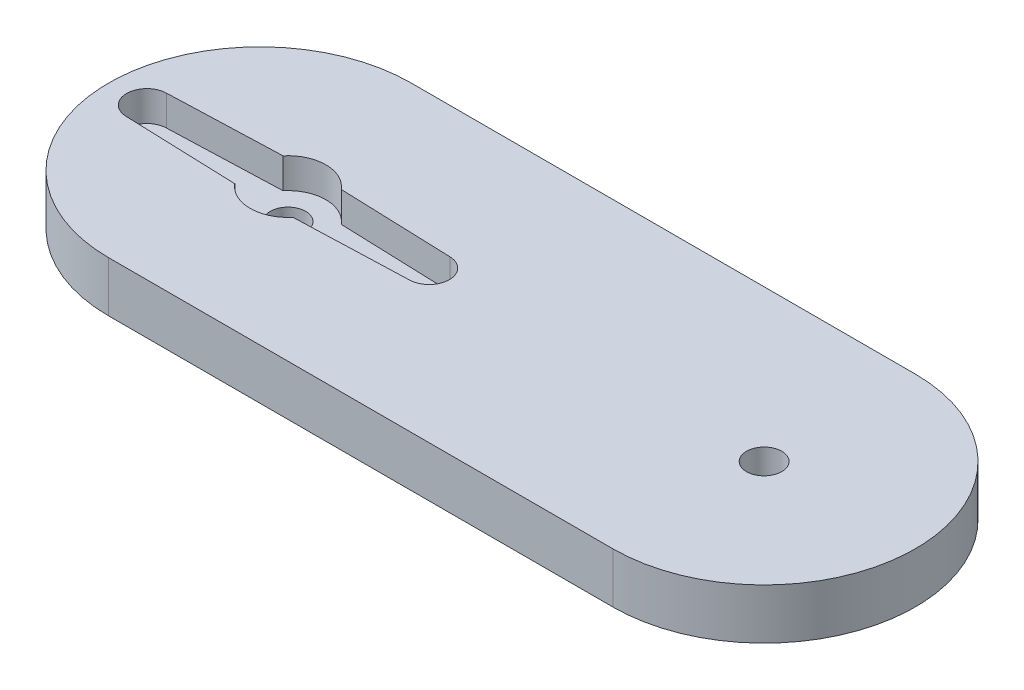
ISO-10303-21;
HEADER;
FILE_DESCRIPTION(('STEP AP214'),'2;1');
FILE_NAME('part.step','',(''),(''),'','','');
FILE_SCHEMA(('AUTOMOTIVE_DESIGN { 1 0 10303 214 1 1 1 1 }'));
ENDSEC;
DATA;
#1=APPLICATION_CONTEXT('core data for automotive mechanical design processes');
#2=APPLICATION_PROTOCOL_DEFINITION('international standard','automotive_design',2000,#1);
#3=PRODUCT_CONTEXT('',#1,'mechanical');
#4=PRODUCT('Part','Part','',(#3));
#5=PRODUCT_RELATED_PRODUCT_CATEGORY('part','',(#4));
#6=PRODUCT_DEFINITION_FORMATION('','',#4);
#7=PRODUCT_DEFINITION_CONTEXT('part definition',#1,'design');
#8=PRODUCT_DEFINITION('design','',#6,#7);
#9=PRODUCT_DEFINITION_SHAPE('','',#8);
#10=(LENGTH_UNIT() NAMED_UNIT(*) SI_UNIT(.MILLI.,.METRE.));
#11=(NAMED_UNIT(*) PLANE_ANGLE_UNIT() SI_UNIT($,.RADIAN.));
#12=(NAMED_UNIT(*) SI_UNIT($,.STERADIAN.) SOLID_ANGLE_UNIT());
#13=UNCERTAINTY_MEASURE_WITH_UNIT(LENGTH_MEASURE(1.E-05),#10,'distance_accuracy_value','');
#14=(GEOMETRIC_REPRESENTATION_CONTEXT(3) GLOBAL_UNCERTAINTY_ASSIGNED_CONTEXT((#13)) GLOBAL_UNIT_ASSIGNED_CONTEXT((#10,
#11,#12)) REPRESENTATION_CONTEXT('',''));
#15=CARTESIAN_POINT('',(0.,0.,0.));
#16=DIRECTION('',(0.,0.,1.));
#17=DIRECTION('',(1.,0.,0.));
#18=AXIS2_PLACEMENT_3D('',#15,#16,#17);
#19=CARTESIAN_POINT('',(0.,5.,0.));
#20=DIRECTION('',(0.,-1.,0.));
#21=DIRECTION('',(0.,0.,-1.));
#22=AXIS2_PLACEMENT_3D('',#19,#20,#21);
#23=PLANE('',#22);
#24=CARTESIAN_POINT('',(0.,5.,0.));
#25=DIRECTION('',(0.,1.,0.));
#26=DIRECTION('',(0.,0.,-1.));
#27=AXIS2_PLACEMENT_3D('',#24,#25,#26);
#28=CIRCLE('',#27,15.);
#29=CARTESIAN_POINT('',(0.,5.,15.));
#30=VERTEX_POINT('',#29);
#31=CARTESIAN_POINT('',(0.,5.,-15.));
#32=VERTEX_POINT('',#31);
#33=EDGE_CURVE('E213',#30,#32,#28,.T.);
#34=ORIENTED_EDGE('',*,*,#33,.T.);
#35=DIRECTION('',(-1.,0.,0.));
#36=VECTOR('',#35,1.);
#37=CARTESIAN_POINT('',(-50.,5.,-15.));
#38=LINE('',#37,#36);
#39=CARTESIAN_POINT('',(-50.,5.,-15.));
#40=VERTEX_POINT('',#39);
#41=EDGE_CURVE('E93',#32,#40,#38,.T.);
#42=ORIENTED_EDGE('',*,*,#41,.T.);
#43=CARTESIAN_POINT('',(-50.,5.,0.));
#44=DIRECTION('',(0.,1.,0.));
#45=DIRECTION('',(0.,0.,1.));
#46=AXIS2_PLACEMENT_3D('',#43,#44,#45);
#47=CIRCLE('',#46,15.);
#48=CARTESIAN_POINT('',(-50.,5.,15.));
#49=VERTEX_POINT('',#48);
#50=EDGE_CURVE('E216',#40,#49,#47,.T.);
#51=ORIENTED_EDGE('',*,*,#50,.T.);
#52=DIRECTION('',(1.,0.,0.));
#53=VECTOR('',#52,1.);
#54=CARTESIAN_POINT('',(-50.,5.,15.));
#55=LINE('',#54,#53);
#56=EDGE_CURVE('E65',#49,#30,#55,.T.);
#57=ORIENTED_EDGE('',*,*,#56,.T.);
#58=EDGE_LOOP('',(#34,#42,#51,#57));
#59=FACE_BOUND('',#58,.T.);
#60=CARTESIAN_POINT('',(0.,5.,0.));
#61=DIRECTION('',(0.,1.,0.));
#62=DIRECTION('',(0.,0.,-1.));
#63=AXIS2_PLACEMENT_3D('',#60,#61,#62);
#64=CIRCLE('',#63,1.75);
#65=CARTESIAN_POINT('',(0.,5.,-1.75000000000001));
#66=VERTEX_POINT('',#65);
#67=EDGE_CURVE('E199',#66,#66,#64,.T.);
#68=ORIENTED_EDGE('',*,*,#67,.F.);
#69=EDGE_LOOP('',(#68));
#70=FACE_BOUND('',#69,.T.);
#71=CARTESIAN_POINT('',(-61.2106377870323,5.,0.));
#72=DIRECTION('',(0.,1.,0.));
#73=DIRECTION('',(0.,0.,1.));
#74=AXIS2_PLACEMENT_3D('',#71,#72,#73);
#75=CIRCLE('',#74,1.99999999999989);
#76=CARTESIAN_POINT('',(-61.2814656274018,5.,1.99874546078984));
#77=VERTEX_POINT('',#76);
#78=CARTESIAN_POINT('',(-61.2814656274019,5.,-1.99874546078982));
#79=VERTEX_POINT('',#78);
#80=EDGE_CURVE('E56',#77,#79,#75,.F.);
#81=ORIENTED_EDGE('',*,*,#80,.T.);
#82=DIRECTION('',(0.999372730394993,0.,-0.0354139201848141));
#83=VECTOR('',#82,1.);
#84=CARTESIAN_POINT('',(-0.147594901167753,5.,-4.16509436409831));
#85=LINE('',#84,#83);
#86=CARTESIAN_POINT('',(-50.0961084973095,5.,-2.39511143376086));
#87=VERTEX_POINT('',#86);
#88=EDGE_CURVE('E156',#79,#87,#85,.T.);
#89=ORIENTED_EDGE('',*,*,#88,.T.);
#90=CARTESIAN_POINT('',(-47.2106377870323,5.,0.));
#91=DIRECTION('',(0.,1.,0.));
#92=DIRECTION('',(0.,0.,1.));
#93=AXIS2_PLACEMENT_3D('',#90,#91,#92);
#94=CIRCLE('',#93,3.74999999999991);
#95=CARTESIAN_POINT('',(-44.3251670767553,5.,-2.39511143376105));
#96=VERTEX_POINT('',#95);
#97=EDGE_CURVE('E192',#96,#87,#94,.T.);
#98=ORIENTED_EDGE('',*,*,#97,.F.);
#99=DIRECTION('',(-0.999372730394995,0.,-0.0354139201847496));
#100=VECTOR('',#99,1.);
#101=CARTESIAN_POINT('',(0.0291768603715252,5.,-0.823364328538849));
#102=LINE('',#101,#100);
#103=CARTESIAN_POINT('',(-33.1398099466627,5.,-1.99874546079073));
#104=VERTEX_POINT('',#103);
#105=EDGE_CURVE('E189',#104,#96,#102,.T.);
#106=ORIENTED_EDGE('',*,*,#105,.F.);
#107=CARTESIAN_POINT('',(-33.2106377870322,5.,-2.6382402541072E-12));
#108=DIRECTION('',(0.,1.,0.));
#109=DIRECTION('',(0.,0.,1.));
#110=AXIS2_PLACEMENT_3D('',#107,#108,#109);
#111=CIRCLE('',#110,1.9999999999981);
#112=CARTESIAN_POINT('',(-33.1398099466627,5.,1.99874546078946));
#113=VERTEX_POINT('',#112);
#114=EDGE_CURVE('E186',#113,#104,#111,.T.);
#115=ORIENTED_EDGE('',*,*,#114,.F.);
#116=DIRECTION('',(-0.999372730394992,0.,0.035413920184841));
#117=VECTOR('',#116,1.);
#118=CARTESIAN_POINT('',(0.0291768603714483,5.,0.823364328534549));
#119=LINE('',#118,#117);
#120=CARTESIAN_POINT('',(-44.3251670767551,5.,2.39511143376081));
#121=VERTEX_POINT('',#120);
#122=EDGE_CURVE('E183',#113,#121,#119,.T.);
#123=ORIENTED_EDGE('',*,*,#122,.T.);
#124=CARTESIAN_POINT('',(-47.2106377870323,5.,0.));
#125=DIRECTION('',(0.,1.,0.));
#126=DIRECTION('',(0.,0.,1.));
#127=AXIS2_PLACEMENT_3D('',#124,#125,#126);
#128=CIRCLE('',#127,3.74999999999992);
#129=CARTESIAN_POINT('',(-50.0961084973095,5.,2.39511143376087));
#130=VERTEX_POINT('',#129);
#131=EDGE_CURVE('E180',#130,#121,#128,.T.);
#132=ORIENTED_EDGE('',*,*,#131,.F.);
#133=DIRECTION('',(0.999372730394993,0.,0.0354139201848138));
#134=VECTOR('',#133,1.);
#135=CARTESIAN_POINT('',(-0.147594901167751,5.,4.1650943640983));
#136=LINE('',#135,#134);
#137=EDGE_CURVE('E177',#77,#130,#136,.T.);
#138=ORIENTED_EDGE('',*,*,#137,.F.);
#139=EDGE_LOOP('',(#81,#89,#98,#106,#115,#123,#132,#138));
#140=FACE_BOUND('',#139,.T.);
#141=ADVANCED_FACE('F40',(#59,#70,#140),#23,.F.);
#142=CARTESIAN_POINT('',(0.,5.,0.));
#143=DIRECTION('',(0.,-1.,0.));
#144=DIRECTION('',(0.,0.,-1.));
#145=AXIS2_PLACEMENT_3D('',#142,#143,#144);
#146=CYLINDRICAL_SURFACE('',#145,15.);
#147=CARTESIAN_POINT('',(0.,0.,0.));
#148=DIRECTION('',(0.,1.,0.));
#149=DIRECTION('',(0.,0.,-1.));
#150=AXIS2_PLACEMENT_3D('',#147,#148,#149);
#151=CIRCLE('',#150,15.);
#152=CARTESIAN_POINT('',(0.,0.,15.));
#153=VERTEX_POINT('',#152);
#154=CARTESIAN_POINT('',(0.,0.,-15.));
#155=VERTEX_POINT('',#154);
#156=EDGE_CURVE('E220',#153,#155,#151,.T.);
#157=ORIENTED_EDGE('',*,*,#156,.T.);
#158=DIRECTION('',(0.,-1.,0.));
#159=VECTOR('',#158,1.);
#160=CARTESIAN_POINT('',(0.,5.,-15.));
#161=LINE('',#160,#159);
#162=EDGE_CURVE('E11',#32,#155,#161,.T.);
#163=ORIENTED_EDGE('',*,*,#162,.F.);
#164=ORIENTED_EDGE('',*,*,#33,.F.);
#165=DIRECTION('',(0.,-1.,0.));
#166=VECTOR('',#165,1.);
#167=CARTESIAN_POINT('',(0.,5.,15.));
#168=LINE('',#167,#166);
#169=EDGE_CURVE('E219',#30,#153,#168,.T.);
#170=ORIENTED_EDGE('',*,*,#169,.T.);
#171=EDGE_LOOP('',(#157,#163,#164,#170));
#172=FACE_BOUND('',#171,.T.);
#173=ADVANCED_FACE('F42',(#172),#146,.T.);
#174=CARTESIAN_POINT('',(-50.,5.,-15.));
#175=DIRECTION('',(0.,0.,1.));
#176=DIRECTION('',(1.,0.,0.));
#177=AXIS2_PLACEMENT_3D('',#174,#175,#176);
#178=PLANE('',#177);
#179=DIRECTION('',(-1.,0.,0.));
#180=VECTOR('',#179,1.);
#181=CARTESIAN_POINT('',(-50.,0.,-15.));
#182=LINE('',#181,#180);
#183=CARTESIAN_POINT('',(-50.,0.,-15.));
#184=VERTEX_POINT('',#183);
#185=EDGE_CURVE('E223',#155,#184,#182,.T.);
#186=ORIENTED_EDGE('',*,*,#185,.T.);
#187=DIRECTION('',(0.,-1.,0.));
#188=VECTOR('',#187,1.);
#189=CARTESIAN_POINT('',(-50.,5.,-15.));
#190=LINE('',#189,#188);
#191=EDGE_CURVE('E49',#40,#184,#190,.T.);
#192=ORIENTED_EDGE('',*,*,#191,.F.);
#193=ORIENTED_EDGE('',*,*,#41,.F.);
#194=ORIENTED_EDGE('',*,*,#162,.T.);
#195=EDGE_LOOP('',(#186,#192,#193,#194));
#196=FACE_BOUND('',#195,.T.);
#197=ADVANCED_FACE('F253',(#196),#178,.F.);
#198=CARTESIAN_POINT('',(-50.,5.,0.));
#199=DIRECTION('',(0.,-1.,0.));
#200=DIRECTION('',(0.,0.,-1.));
#201=AXIS2_PLACEMENT_3D('',#198,#199,#200);
#202=CYLINDRICAL_SURFACE('',#201,15.);
#203=CARTESIAN_POINT('',(-50.,0.,0.));
#204=DIRECTION('',(0.,1.,0.));
#205=DIRECTION('',(0.,0.,1.));
#206=AXIS2_PLACEMENT_3D('',#203,#204,#205);
#207=CIRCLE('',#206,15.);
#208=CARTESIAN_POINT('',(-50.,0.,15.));
#209=VERTEX_POINT('',#208);
#210=EDGE_CURVE('E225',#184,#209,#207,.T.);
#211=ORIENTED_EDGE('',*,*,#210,.T.);
#212=DIRECTION('',(0.,-1.,0.));
#213=VECTOR('',#212,1.);
#214=CARTESIAN_POINT('',(-50.,5.,15.));
#215=LINE('',#214,#213);
#216=EDGE_CURVE('E229',#49,#209,#215,.T.);
#217=ORIENTED_EDGE('',*,*,#216,.F.);
#218=ORIENTED_EDGE('',*,*,#50,.F.);
#219=ORIENTED_EDGE('',*,*,#191,.T.);
#220=EDGE_LOOP('',(#211,#217,#218,#219));
#221=FACE_BOUND('',#220,.T.);
#222=ADVANCED_FACE('F235',(#221),#202,.T.);
#223=CARTESIAN_POINT('',(-50.,5.,15.));
#224=DIRECTION('',(0.,0.,-1.));
#225=DIRECTION('',(-1.,0.,0.));
#226=AXIS2_PLACEMENT_3D('',#223,#224,#225);
#227=PLANE('',#226);
#228=DIRECTION('',(1.,0.,0.));
#229=VECTOR('',#228,1.);
#230=CARTESIAN_POINT('',(-50.,0.,15.));
#231=LINE('',#230,#229);
#232=EDGE_CURVE('E86',#209,#153,#231,.T.);
#233=ORIENTED_EDGE('',*,*,#232,.T.);
#234=ORIENTED_EDGE('',*,*,#169,.F.);
#235=ORIENTED_EDGE('',*,*,#56,.F.);
#236=ORIENTED_EDGE('',*,*,#216,.T.);
#237=EDGE_LOOP('',(#233,#234,#235,#236));
#238=FACE_BOUND('',#237,.T.);
#239=ADVANCED_FACE('F243',(#238),#227,.F.);
#240=CARTESIAN_POINT('',(0.,0.,0.));
#241=DIRECTION('',(0.,-1.,0.));
#242=DIRECTION('',(0.,0.,-1.));
#243=AXIS2_PLACEMENT_3D('',#240,#241,#242);
#244=PLANE('',#243);
#245=CARTESIAN_POINT('',(-47.2106377870323,0.,0.));
#246=DIRECTION('',(0.,-1.,0.));
#247=DIRECTION('',(0.,0.,-1.));
#248=AXIS2_PLACEMENT_3D('',#245,#246,#247);
#249=CIRCLE('',#248,1.75);
#250=CARTESIAN_POINT('',(-47.2106377870323,0.,-1.75000000000001));
#251=VERTEX_POINT('',#250);
#252=EDGE_CURVE('E178',#251,#251,#249,.T.);
#253=ORIENTED_EDGE('',*,*,#252,.F.);
#254=EDGE_LOOP('',(#253));
#255=FACE_BOUND('',#254,.T.);
#256=CARTESIAN_POINT('',(0.,0.,0.));
#257=DIRECTION('',(0.,-1.,0.));
#258=DIRECTION('',(0.,0.,-1.));
#259=AXIS2_PLACEMENT_3D('',#256,#257,#258);
#260=CIRCLE('',#259,1.75);
#261=CARTESIAN_POINT('',(0.,0.,-1.75000000000001));
#262=VERTEX_POINT('',#261);
#263=EDGE_CURVE('E44',#262,#262,#260,.T.);
#264=ORIENTED_EDGE('',*,*,#263,.F.);
#265=EDGE_LOOP('',(#264));
#266=FACE_BOUND('',#265,.T.);
#267=ORIENTED_EDGE('',*,*,#156,.F.);
#268=ORIENTED_EDGE('',*,*,#232,.F.);
#269=ORIENTED_EDGE('',*,*,#210,.F.);
#270=ORIENTED_EDGE('',*,*,#185,.F.);
#271=EDGE_LOOP('',(#267,#268,#269,#270));
#272=FACE_BOUND('',#271,.T.);
#273=ADVANCED_FACE('F239',(#255,#266,#272),#244,.T.);
#274=CARTESIAN_POINT('',(0.,-5.,0.));
#275=DIRECTION('',(0.,1.,0.));
#276=DIRECTION('',(0.,0.,1.));
#277=AXIS2_PLACEMENT_3D('',#274,#275,#276);
#278=CYLINDRICAL_SURFACE('',#277,1.75);
#279=ORIENTED_EDGE('',*,*,#263,.T.);
#280=EDGE_LOOP('',(#279));
#281=FACE_BOUND('',#280,.T.);
#282=ORIENTED_EDGE('',*,*,#67,.T.);
#283=EDGE_LOOP('',(#282));
#284=FACE_BOUND('',#283,.T.);
#285=ADVANCED_FACE('F250',(#281,#284),#278,.F.);
#286=CARTESIAN_POINT('',(-61.2106377870323,2.,0.));
#287=DIRECTION('',(0.,1.,0.));
#288=DIRECTION('',(0.,0.,1.));
#289=AXIS2_PLACEMENT_3D('',#286,#287,#288);
#290=CYLINDRICAL_SURFACE('',#289,1.99999999999989);
#291=ORIENTED_EDGE('',*,*,#80,.F.);
#292=DIRECTION('',(0.,1.,0.));
#293=VECTOR('',#292,1.);
#294=CARTESIAN_POINT('',(-61.2814656274018,2.,1.99874546078984));
#295=LINE('',#294,#293);
#296=CARTESIAN_POINT('',(-61.2814656274018,2.,1.99874546078984));
#297=VERTEX_POINT('',#296);
#298=EDGE_CURVE('E138',#297,#77,#295,.T.);
#299=ORIENTED_EDGE('',*,*,#298,.F.);
#300=CARTESIAN_POINT('',(-61.2106377870323,2.,0.));
#301=DIRECTION('',(0.,1.,0.));
#302=DIRECTION('',(0.,0.,1.));
#303=AXIS2_PLACEMENT_3D('',#300,#301,#302);
#304=CIRCLE('',#303,1.99999999999989);
#305=CARTESIAN_POINT('',(-61.2814656274019,2.,-1.99874546078982));
#306=VERTEX_POINT('',#305);
#307=EDGE_CURVE('E141',#297,#306,#304,.F.);
#308=ORIENTED_EDGE('',*,*,#307,.T.);
#309=DIRECTION('',(0.,1.,0.));
#310=VECTOR('',#309,1.);
#311=CARTESIAN_POINT('',(-61.2814656274019,2.,-1.99874546078982));
#312=LINE('',#311,#310);
#313=EDGE_CURVE('E197',#306,#79,#312,.T.);
#314=ORIENTED_EDGE('',*,*,#313,.T.);
#315=EDGE_LOOP('',(#291,#299,#308,#314));
#316=FACE_BOUND('',#315,.T.);
#317=ADVANCED_FACE('F140',(#316),#290,.F.);
#318=CARTESIAN_POINT('',(-0.147594901167753,2.,-4.16509436409831));
#319=DIRECTION('',(0.0354139201848141,0.,0.999372730394993));
#320=DIRECTION('',(0.999372730394993,0.,-0.0354139201848141));
#321=AXIS2_PLACEMENT_3D('',#318,#319,#320);
#322=PLANE('',#321);
#323=ORIENTED_EDGE('',*,*,#88,.F.);
#324=ORIENTED_EDGE('',*,*,#313,.F.);
#325=DIRECTION('',(0.999372730394993,0.,-0.0354139201848141));
#326=VECTOR('',#325,1.);
#327=CARTESIAN_POINT('',(-0.147594901167753,2.,-4.16509436409831));
#328=LINE('',#327,#326);
#329=CARTESIAN_POINT('',(-50.0961084973095,2.,-2.39511143376086));
#330=VERTEX_POINT('',#329);
#331=EDGE_CURVE('E148',#306,#330,#328,.T.);
#332=ORIENTED_EDGE('',*,*,#331,.T.);
#333=DIRECTION('',(0.,1.,0.));
#334=VECTOR('',#333,1.);
#335=CARTESIAN_POINT('',(-50.0961084973095,2.,-2.39511143376086));
#336=LINE('',#335,#334);
#337=EDGE_CURVE('E200',#330,#87,#336,.T.);
#338=ORIENTED_EDGE('',*,*,#337,.T.);
#339=EDGE_LOOP('',(#323,#324,#332,#338));
#340=FACE_BOUND('',#339,.T.);
#341=ADVANCED_FACE('F267',(#340),#322,.T.);
#342=CARTESIAN_POINT('',(-47.2106377870323,2.,0.));
#343=DIRECTION('',(0.,1.,0.));
#344=DIRECTION('',(0.,0.,1.));
#345=AXIS2_PLACEMENT_3D('',#342,#343,#344);
#346=CYLINDRICAL_SURFACE('',#345,3.74999999999991);
#347=ORIENTED_EDGE('',*,*,#97,.T.);
#348=ORIENTED_EDGE('',*,*,#337,.F.);
#349=CARTESIAN_POINT('',(-47.2106377870323,2.,0.));
#350=DIRECTION('',(0.,1.,0.));
#351=DIRECTION('',(0.,0.,1.));
#352=AXIS2_PLACEMENT_3D('',#349,#350,#351);
#353=CIRCLE('',#352,3.74999999999991);
#354=CARTESIAN_POINT('',(-44.3251670767553,2.,-2.39511143376105));
#355=VERTEX_POINT('',#354);
#356=EDGE_CURVE('E173',#355,#330,#353,.T.);
#357=ORIENTED_EDGE('',*,*,#356,.F.);
#358=DIRECTION('',(0.,1.,0.));
#359=VECTOR('',#358,1.);
#360=CARTESIAN_POINT('',(-44.3251670767553,2.,-2.39511143376105));
#361=LINE('',#360,#359);
#362=EDGE_CURVE('E202',#355,#96,#361,.T.);
#363=ORIENTED_EDGE('',*,*,#362,.T.);
#364=EDGE_LOOP('',(#347,#348,#357,#363));
#365=FACE_BOUND('',#364,.T.);
#366=ADVANCED_FACE('F285',(#365),#346,.F.);
#367=CARTESIAN_POINT('',(0.0291768603715252,2.,-0.823364328538849));
#368=DIRECTION('',(0.0354139201847496,0.,-0.999372730394995));
#369=DIRECTION('',(-0.999372730394995,0.,-0.0354139201847496));
#370=AXIS2_PLACEMENT_3D('',#367,#368,#369);
#371=PLANE('',#370);
#372=ORIENTED_EDGE('',*,*,#105,.T.);
#373=ORIENTED_EDGE('',*,*,#362,.F.);
#374=DIRECTION('',(-0.999372730394995,0.,-0.0354139201847496));
#375=VECTOR('',#374,1.);
#376=CARTESIAN_POINT('',(0.0291768603715252,2.,-0.823364328538849));
#377=LINE('',#376,#375);
#378=CARTESIAN_POINT('',(-33.1398099466627,2.,-1.99874546079073));
#379=VERTEX_POINT('',#378);
#380=EDGE_CURVE('E170',#379,#355,#377,.T.);
#381=ORIENTED_EDGE('',*,*,#380,.F.);
#382=DIRECTION('',(0.,1.,0.));
#383=VECTOR('',#382,1.);
#384=CARTESIAN_POINT('',(-33.1398099466627,2.,-1.99874546079073));
#385=LINE('',#384,#383);
#386=EDGE_CURVE('E204',#379,#104,#385,.T.);
#387=ORIENTED_EDGE('',*,*,#386,.T.);
#388=EDGE_LOOP('',(#372,#373,#381,#387));
#389=FACE_BOUND('',#388,.T.);
#390=ADVANCED_FACE('F281',(#389),#371,.F.);
#391=CARTESIAN_POINT('',(-33.2106377870322,2.,-2.6382402541072E-12));
#392=DIRECTION('',(0.,1.,0.));
#393=DIRECTION('',(0.,0.,1.));
#394=AXIS2_PLACEMENT_3D('',#391,#392,#393);
#395=CYLINDRICAL_SURFACE('',#394,1.9999999999981);
#396=ORIENTED_EDGE('',*,*,#114,.T.);
#397=ORIENTED_EDGE('',*,*,#386,.F.);
#398=CARTESIAN_POINT('',(-33.2106377870322,2.,-2.6382402541072E-12));
#399=DIRECTION('',(0.,1.,0.));
#400=DIRECTION('',(0.,0.,1.));
#401=AXIS2_PLACEMENT_3D('',#398,#399,#400);
#402=CIRCLE('',#401,1.9999999999981);
#403=CARTESIAN_POINT('',(-33.1398099466627,2.,1.99874546078946));
#404=VERTEX_POINT('',#403);
#405=EDGE_CURVE('E167',#404,#379,#402,.T.);
#406=ORIENTED_EDGE('',*,*,#405,.F.);
#407=DIRECTION('',(0.,1.,0.));
#408=VECTOR('',#407,1.);
#409=CARTESIAN_POINT('',(-33.1398099466627,2.,1.99874546078946));
#410=LINE('',#409,#408);
#411=EDGE_CURVE('E206',#404,#113,#410,.T.);
#412=ORIENTED_EDGE('',*,*,#411,.T.);
#413=EDGE_LOOP('',(#396,#397,#406,#412));
#414=FACE_BOUND('',#413,.T.);
#415=ADVANCED_FACE('F277',(#414),#395,.F.);
#416=CARTESIAN_POINT('',(0.0291768603714483,2.,0.823364328534549));
#417=DIRECTION('',(-0.035413920184841,0.,-0.999372730394992));
#418=DIRECTION('',(-0.999372730394992,0.,0.035413920184841));
#419=AXIS2_PLACEMENT_3D('',#416,#417,#418);
#420=PLANE('',#419);
#421=ORIENTED_EDGE('',*,*,#122,.F.);
#422=ORIENTED_EDGE('',*,*,#411,.F.);
#423=DIRECTION('',(-0.999372730394992,0.,0.035413920184841));
#424=VECTOR('',#423,1.);
#425=CARTESIAN_POINT('',(0.0291768603714483,2.,0.823364328534549));
#426=LINE('',#425,#424);
#427=CARTESIAN_POINT('',(-44.3251670767551,2.,2.39511143376081));
#428=VERTEX_POINT('',#427);
#429=EDGE_CURVE('E162',#404,#428,#426,.T.);
#430=ORIENTED_EDGE('',*,*,#429,.T.);
#431=DIRECTION('',(0.,1.,0.));
#432=VECTOR('',#431,1.);
#433=CARTESIAN_POINT('',(-44.3251670767551,2.,2.39511143376081));
#434=LINE('',#433,#432);
#435=EDGE_CURVE('E208',#428,#121,#434,.T.);
#436=ORIENTED_EDGE('',*,*,#435,.T.);
#437=EDGE_LOOP('',(#421,#422,#430,#436));
#438=FACE_BOUND('',#437,.T.);
#439=ADVANCED_FACE('F273',(#438),#420,.T.);
#440=CARTESIAN_POINT('',(-47.2106377870323,2.,0.));
#441=DIRECTION('',(0.,1.,0.));
#442=DIRECTION('',(0.,0.,1.));
#443=AXIS2_PLACEMENT_3D('',#440,#441,#442);
#444=CYLINDRICAL_SURFACE('',#443,3.74999999999992);
#445=ORIENTED_EDGE('',*,*,#131,.T.);
#446=ORIENTED_EDGE('',*,*,#435,.F.);
#447=CARTESIAN_POINT('',(-47.2106377870323,2.,0.));
#448=DIRECTION('',(0.,1.,0.));
#449=DIRECTION('',(0.,0.,1.));
#450=AXIS2_PLACEMENT_3D('',#447,#448,#449);
#451=CIRCLE('',#450,3.74999999999992);
#452=CARTESIAN_POINT('',(-50.0961084973095,2.,2.39511143376087));
#453=VERTEX_POINT('',#452);
#454=EDGE_CURVE('E160',#453,#428,#451,.T.);
#455=ORIENTED_EDGE('',*,*,#454,.F.);
#456=DIRECTION('',(0.,1.,0.));
#457=VECTOR('',#456,1.);
#458=CARTESIAN_POINT('',(-50.0961084973095,2.,2.39511143376087));
#459=LINE('',#458,#457);
#460=EDGE_CURVE('E147',#453,#130,#459,.T.);
#461=ORIENTED_EDGE('',*,*,#460,.T.);
#462=EDGE_LOOP('',(#445,#446,#455,#461));
#463=FACE_BOUND('',#462,.T.);
#464=ADVANCED_FACE('F270',(#463),#444,.F.);
#465=CARTESIAN_POINT('',(-0.147594901167751,2.,4.1650943640983));
#466=DIRECTION('',(-0.0354139201848138,0.,0.999372730394993));
#467=DIRECTION('',(0.999372730394993,0.,0.0354139201848138));
#468=AXIS2_PLACEMENT_3D('',#465,#466,#467);
#469=PLANE('',#468);
#470=ORIENTED_EDGE('',*,*,#137,.T.);
#471=ORIENTED_EDGE('',*,*,#460,.F.);
#472=DIRECTION('',(0.999372730394993,0.,0.0354139201848138));
#473=VECTOR('',#472,1.);
#474=CARTESIAN_POINT('',(-0.147594901167751,2.,4.1650943640983));
#475=LINE('',#474,#473);
#476=EDGE_CURVE('E154',#297,#453,#475,.T.);
#477=ORIENTED_EDGE('',*,*,#476,.F.);
#478=ORIENTED_EDGE('',*,*,#298,.T.);
#479=EDGE_LOOP('',(#470,#471,#477,#478));
#480=FACE_BOUND('',#479,.T.);
#481=ADVANCED_FACE('F158',(#480),#469,.F.);
#482=CARTESIAN_POINT('',(0.,2.,0.));
#483=DIRECTION('',(0.,1.,0.));
#484=DIRECTION('',(0.,0.,1.));
#485=AXIS2_PLACEMENT_3D('',#482,#483,#484);
#486=PLANE('',#485);
#487=CARTESIAN_POINT('',(-47.2106377870323,2.,0.));
#488=DIRECTION('',(0.,1.,0.));
#489=DIRECTION('',(0.,0.,1.));
#490=AXIS2_PLACEMENT_3D('',#487,#488,#489);
#491=CIRCLE('',#490,1.75);
#492=CARTESIAN_POINT('',(-47.2106377870323,2.,1.75));
#493=VERTEX_POINT('',#492);
#494=EDGE_CURVE('E306',#493,#493,#491,.T.);
#495=ORIENTED_EDGE('',*,*,#494,.F.);
#496=EDGE_LOOP('',(#495));
#497=FACE_BOUND('',#496,.T.);
#498=ORIENTED_EDGE('',*,*,#307,.F.);
#499=ORIENTED_EDGE('',*,*,#476,.T.);
#500=ORIENTED_EDGE('',*,*,#454,.T.);
#501=ORIENTED_EDGE('',*,*,#429,.F.);
#502=ORIENTED_EDGE('',*,*,#405,.T.);
#503=ORIENTED_EDGE('',*,*,#380,.T.);
#504=ORIENTED_EDGE('',*,*,#356,.T.);
#505=ORIENTED_EDGE('',*,*,#331,.F.);
#506=EDGE_LOOP('',(#498,#499,#500,#501,#502,#503,#504,#505));
#507=FACE_BOUND('',#506,.T.);
#508=ADVANCED_FACE('F152',(#497,#507),#486,.T.);
#509=CARTESIAN_POINT('',(-47.2106377870323,-8.,0.));
#510=DIRECTION('',(0.,1.,0.));
#511=DIRECTION('',(0.,0.,1.));
#512=AXIS2_PLACEMENT_3D('',#509,#510,#511);
#513=CYLINDRICAL_SURFACE('',#512,1.75);
#514=ORIENTED_EDGE('',*,*,#252,.T.);
#515=EDGE_LOOP('',(#514));
#516=FACE_BOUND('',#515,.T.);
#517=ORIENTED_EDGE('',*,*,#494,.T.);
#518=EDGE_LOOP('',(#517));
#519=FACE_BOUND('',#518,.T.);
#520=ADVANCED_FACE('F295',(#516,#519),#513,.F.);
#521=CLOSED_SHELL('',(#141,#173,#197,#222,#239,#273,#285,#317,#341,#366,#390,#415,#439,#464,
#481,#508,#520));
#522=MANIFOLD_SOLID_BREP('B2',#521);
#523=ADVANCED_BREP_SHAPE_REPRESENTATION('',(#18,#522),#14);
#524=SHAPE_DEFINITION_REPRESENTATION(#9,#523);
ENDSEC;
END-ISO-10303-21;
